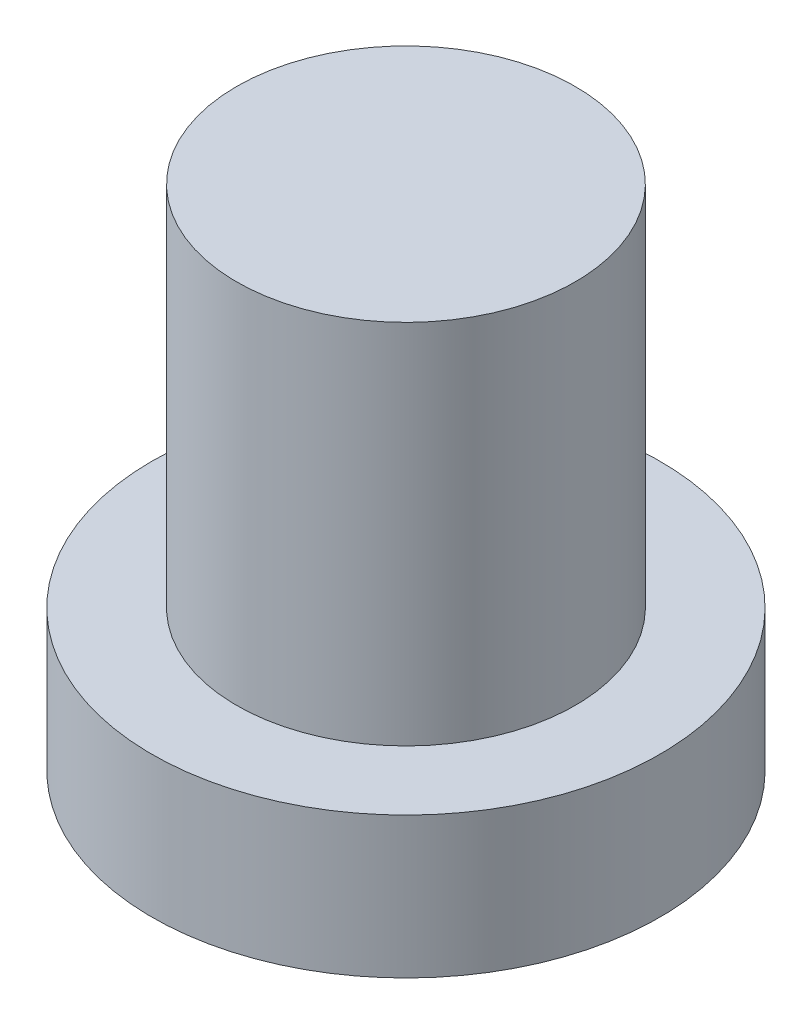
ISO-10303-21;
HEADER;
FILE_DESCRIPTION(('STEP AP214'),'2;1');
FILE_NAME('part.step','',(''),(''),'','','');
FILE_SCHEMA(('AUTOMOTIVE_DESIGN { 1 0 10303 214 1 1 1 1 }'));
ENDSEC;
DATA;
#1=APPLICATION_CONTEXT('core data for automotive mechanical design processes');
#2=APPLICATION_PROTOCOL_DEFINITION('international standard','automotive_design',2000,#1);
#3=PRODUCT_CONTEXT('',#1,'mechanical');
#4=PRODUCT('Part','Part','',(#3));
#5=PRODUCT_RELATED_PRODUCT_CATEGORY('part','',(#4));
#6=PRODUCT_DEFINITION_FORMATION('','',#4);
#7=PRODUCT_DEFINITION_CONTEXT('part definition',#1,'design');
#8=PRODUCT_DEFINITION('design','',#6,#7);
#9=PRODUCT_DEFINITION_SHAPE('','',#8);
#10=(LENGTH_UNIT() NAMED_UNIT(*) SI_UNIT(.MILLI.,.METRE.));
#11=(NAMED_UNIT(*) PLANE_ANGLE_UNIT() SI_UNIT($,.RADIAN.));
#12=(NAMED_UNIT(*) SI_UNIT($,.STERADIAN.) SOLID_ANGLE_UNIT());
#13=UNCERTAINTY_MEASURE_WITH_UNIT(LENGTH_MEASURE(1.E-05),#10,'distance_accuracy_value','');
#14=(GEOMETRIC_REPRESENTATION_CONTEXT(3) GLOBAL_UNCERTAINTY_ASSIGNED_CONTEXT((#13)) GLOBAL_UNIT_ASSIGNED_CONTEXT((#10,
#11,#12)) REPRESENTATION_CONTEXT('',''));
#15=CARTESIAN_POINT('',(0.,0.,0.));
#16=DIRECTION('',(0.,0.,1.));
#17=DIRECTION('',(1.,0.,0.));
#18=AXIS2_PLACEMENT_3D('',#15,#16,#17);
#19=CARTESIAN_POINT('',(0.,0.,0.));
#20=DIRECTION('',(0.,1.,0.));
#21=DIRECTION('',(-1.,0.,0.));
#22=AXIS2_PLACEMENT_3D('',#19,#20,#21);
#23=PLANE('',#22);
#24=CARTESIAN_POINT('',(0.,0.,0.));
#25=DIRECTION('',(0.,1.,0.));
#26=DIRECTION('',(-1.,0.,0.));
#27=AXIS2_PLACEMENT_3D('',#24,#25,#26);
#28=CIRCLE('',#27,9.);
#29=CARTESIAN_POINT('',(-8.99999999999999,0.,0.));
#30=VERTEX_POINT('',#29);
#31=EDGE_CURVE('E10',#30,#30,#28,.T.);
#32=ORIENTED_EDGE('',*,*,#31,.F.);
#33=EDGE_LOOP('',(#32));
#34=FACE_BOUND('',#33,.T.);
#35=ADVANCED_FACE('F39',(#34),#23,.F.);
#36=CARTESIAN_POINT('',(0.,23.,0.));
#37=DIRECTION('',(0.,1.,0.));
#38=DIRECTION('',(-1.,0.,0.));
#39=AXIS2_PLACEMENT_3D('',#36,#37,#38);
#40=CYLINDRICAL_SURFACE('',#39,9.);
#41=CARTESIAN_POINT('',(0.,5.,0.));
#42=DIRECTION('',(0.,1.,0.));
#43=DIRECTION('',(-1.,0.,0.));
#44=AXIS2_PLACEMENT_3D('',#41,#42,#43);
#45=CIRCLE('',#44,9.);
#46=CARTESIAN_POINT('',(-8.99999999999999,4.99999999999999,0.));
#47=VERTEX_POINT('',#46);
#48=EDGE_CURVE('E45',#47,#47,#45,.T.);
#49=ORIENTED_EDGE('',*,*,#48,.F.);
#50=EDGE_LOOP('',(#49));
#51=FACE_BOUND('',#50,.T.);
#52=ORIENTED_EDGE('',*,*,#31,.T.);
#53=EDGE_LOOP('',(#52));
#54=FACE_BOUND('',#53,.T.);
#55=ADVANCED_FACE('F69',(#51,#54),#40,.T.);
#56=CARTESIAN_POINT('',(9.,5.,0.));
#57=DIRECTION('',(0.,-1.,0.));
#58=DIRECTION('',(1.,0.,0.));
#59=AXIS2_PLACEMENT_3D('',#56,#57,#58);
#60=PLANE('',#59);
#61=CARTESIAN_POINT('',(0.,4.99999999999999,0.));
#62=DIRECTION('',(0.,1.,0.));
#63=DIRECTION('',(-1.,0.,0.));
#64=AXIS2_PLACEMENT_3D('',#61,#62,#63);
#65=CIRCLE('',#64,6.);
#66=CARTESIAN_POINT('',(-5.99999999999999,4.99999999999999,0.));
#67=VERTEX_POINT('',#66);
#68=EDGE_CURVE('E49',#67,#67,#65,.T.);
#69=ORIENTED_EDGE('',*,*,#68,.F.);
#70=EDGE_LOOP('',(#69));
#71=FACE_BOUND('',#70,.T.);
#72=ORIENTED_EDGE('',*,*,#48,.T.);
#73=EDGE_LOOP('',(#72));
#74=FACE_BOUND('',#73,.T.);
#75=ADVANCED_FACE('F64',(#71,#74),#60,.F.);
#76=CARTESIAN_POINT('',(0.,23.,0.));
#77=DIRECTION('',(0.,1.,0.));
#78=DIRECTION('',(-1.,0.,0.));
#79=AXIS2_PLACEMENT_3D('',#76,#77,#78);
#80=CYLINDRICAL_SURFACE('',#79,6.);
#81=CARTESIAN_POINT('',(0.,18.,0.));
#82=DIRECTION('',(0.,1.,0.));
#83=DIRECTION('',(-1.,0.,0.));
#84=AXIS2_PLACEMENT_3D('',#81,#82,#83);
#85=CIRCLE('',#84,6.);
#86=CARTESIAN_POINT('',(-6.,18.,0.));
#87=VERTEX_POINT('',#86);
#88=EDGE_CURVE('E53',#87,#87,#85,.T.);
#89=ORIENTED_EDGE('',*,*,#88,.F.);
#90=EDGE_LOOP('',(#89));
#91=FACE_BOUND('',#90,.T.);
#92=ORIENTED_EDGE('',*,*,#68,.T.);
#93=EDGE_LOOP('',(#92));
#94=FACE_BOUND('',#93,.T.);
#95=ADVANCED_FACE('F61',(#91,#94),#80,.T.);
#96=CARTESIAN_POINT('',(6.,18.,0.));
#97=DIRECTION('',(0.,-1.,0.));
#98=DIRECTION('',(1.,0.,0.));
#99=AXIS2_PLACEMENT_3D('',#96,#97,#98);
#100=PLANE('',#99);
#101=ORIENTED_EDGE('',*,*,#88,.T.);
#102=EDGE_LOOP('',(#101));
#103=FACE_BOUND('',#102,.T.);
#104=ADVANCED_FACE('F59',(#103),#100,.F.);
#105=CLOSED_SHELL('',(#35,#55,#75,#95,#104));
#106=MANIFOLD_SOLID_BREP('B2',#105);
#107=ADVANCED_BREP_SHAPE_REPRESENTATION('',(#18,#106),#14);
#108=SHAPE_DEFINITION_REPRESENTATION(#9,#107);
ENDSEC;
END-ISO-10303-21;
